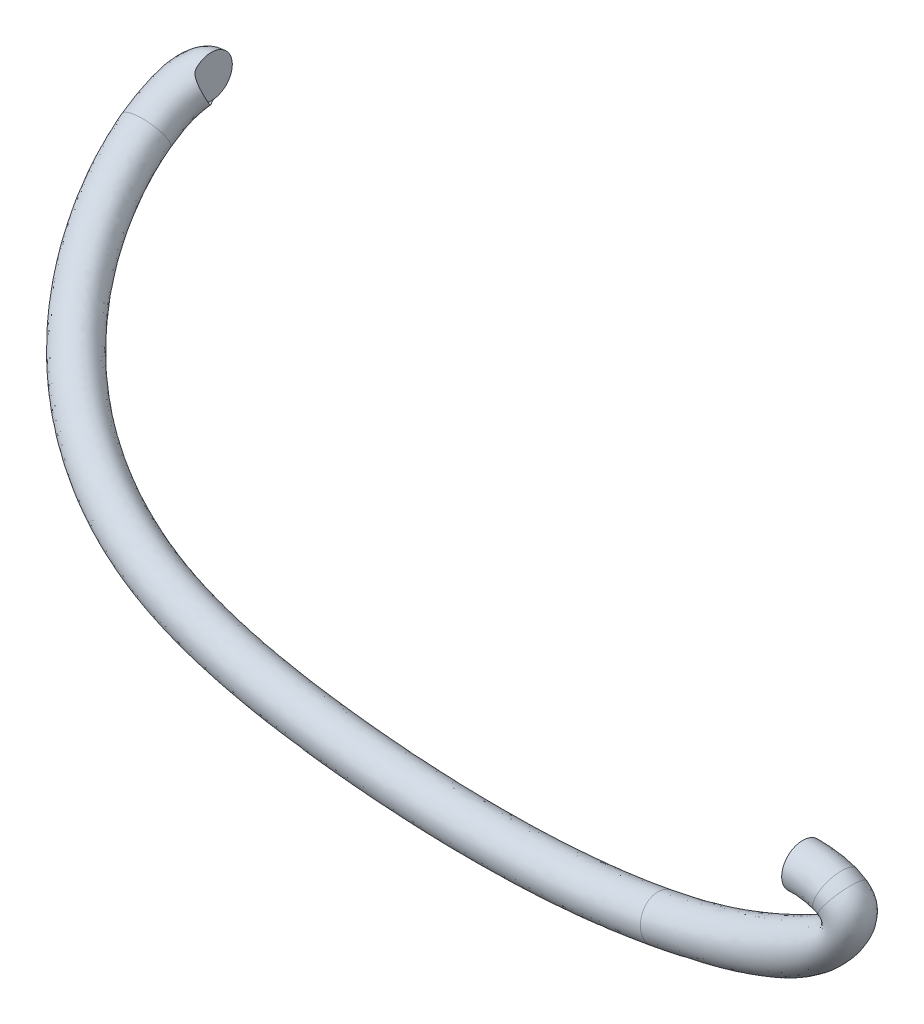
ISO-10303-21;
HEADER;
FILE_DESCRIPTION(('STEP AP214'),'2;1');
FILE_NAME('part.step','',(''),(''),'','','');
FILE_SCHEMA(('AUTOMOTIVE_DESIGN { 1 0 10303 214 1 1 1 1 }'));
ENDSEC;
DATA;
#1=APPLICATION_CONTEXT('core data for automotive mechanical design processes');
#2=APPLICATION_PROTOCOL_DEFINITION('international standard','automotive_design',2000,#1);
#3=PRODUCT_CONTEXT('',#1,'mechanical');
#4=PRODUCT('Part','Part','',(#3));
#5=PRODUCT_RELATED_PRODUCT_CATEGORY('part','',(#4));
#6=PRODUCT_DEFINITION_FORMATION('','',#4);
#7=PRODUCT_DEFINITION_CONTEXT('part definition',#1,'design');
#8=PRODUCT_DEFINITION('design','',#6,#7);
#9=PRODUCT_DEFINITION_SHAPE('','',#8);
#10=(LENGTH_UNIT() NAMED_UNIT(*) SI_UNIT(.MILLI.,.METRE.));
#11=(NAMED_UNIT(*) PLANE_ANGLE_UNIT() SI_UNIT($,.RADIAN.));
#12=(NAMED_UNIT(*) SI_UNIT($,.STERADIAN.) SOLID_ANGLE_UNIT());
#13=UNCERTAINTY_MEASURE_WITH_UNIT(LENGTH_MEASURE(1.E-05),#10,'distance_accuracy_value','');
#14=(GEOMETRIC_REPRESENTATION_CONTEXT(3) GLOBAL_UNCERTAINTY_ASSIGNED_CONTEXT((#13)) GLOBAL_UNIT_ASSIGNED_CONTEXT((#10,
#11,#12)) REPRESENTATION_CONTEXT('',''));
#15=CARTESIAN_POINT('',(0.,0.,0.));
#16=DIRECTION('',(0.,0.,1.));
#17=DIRECTION('',(1.,0.,0.));
#18=AXIS2_PLACEMENT_3D('',#15,#16,#17);
#19=CARTESIAN_POINT('',(271.467470703832,62.9021160797935,181.52291610421));
#20=DIRECTION('',(1.,0.,0.));
#21=DIRECTION('',(0.,0.,-1.));
#22=AXIS2_PLACEMENT_3D('',#19,#20,#21);
#23=PLANE('',#22);
#24=CARTESIAN_POINT('',(271.467470703832,62.9021160797935,181.52291610421));
#25=DIRECTION('',(1.,0.,0.));
#26=DIRECTION('',(0.,0.,-1.));
#27=AXIS2_PLACEMENT_3D('',#24,#25,#26);
#28=CIRCLE('',#27,8.00000000000001);
#29=CARTESIAN_POINT('',(271.467470703832,62.9021160797935,173.52291610421));
#30=VERTEX_POINT('',#29);
#31=EDGE_CURVE('E38',#30,#30,#28,.T.);
#32=ORIENTED_EDGE('',*,*,#31,.F.);
#33=EDGE_LOOP('',(#32));
#34=FACE_BOUND('',#33,.T.);
#35=ADVANCED_FACE('F35',(#34),#23,.F.);
#36=CARTESIAN_POINT('',(-65.7016419080952,98.6716742459517,69.8195888462359));
#37=DIRECTION('',(1.,1.38037576269946E-12,-1.07162146066599E-13));
#38=DIRECTION('',(1.27158228966191E-12,-0.885032139258221,0.465529926513864));
#39=AXIS2_PLACEMENT_3D('',#36,#37,#38);
#40=PLANE('',#39);
#41=CARTESIAN_POINT('',(-65.7016419080952,98.6716742459517,69.8195888462359));
#42=DIRECTION('',(-1.,-1.37902013196725E-12,1.05987701605733E-13));
#43=DIRECTION('',(1.26981758441503E-12,-0.885032139258227,0.465529926513867));
#44=AXIS2_PLACEMENT_3D('',#41,#42,#43);
#45=CIRCLE('',#44,7.99999999999996);
#46=CARTESIAN_POINT('',(-65.701641908085,91.5914171318859,73.5438282583468));
#47=VERTEX_POINT('',#46);
#48=EDGE_CURVE('E44',#47,#47,#45,.T.);
#49=ORIENTED_EDGE('',*,*,#48,.F.);
#50=EDGE_LOOP('',(#49));
#51=FACE_BOUND('',#50,.T.);
#52=ADVANCED_FACE('F258',(#51),#40,.T.);
#53=CARTESIAN_POINT('',(271.467470703832,62.9021160797935,173.52291610421));
#54=CARTESIAN_POINT('',(274.677446249311,62.9052396736422,173.522916104121));
#55=CARTESIAN_POINT('',(277.473503314875,62.6825918502121,173.53570040913));
#56=CARTESIAN_POINT('',(281.460180135996,61.9790707380052,173.575370648221));
#57=CARTESIAN_POINT('',(282.876155099257,61.6083107984834,173.596175101743));
#58=CARTESIAN_POINT('',(284.111598290549,61.1540883737996,173.621492785296));
#59=CARTESIAN_POINT('',(271.467470703832,78.9021160797935,173.52291610421));
#60=CARTESIAN_POINT('',(275.428867519354,78.9052396740792,173.529163292394));
#61=CARTESIAN_POINT('',(279.115790153637,78.6414527736942,173.550584008224));
#62=CARTESIAN_POINT('',(285.034623800124,77.5944642644376,173.619567355465));
#63=CARTESIAN_POINT('',(287.353420199476,77.0236434522984,173.655508590819));
#64=CARTESIAN_POINT('',(289.654417462155,76.1710320667003,173.706674334146));
#65=CARTESIAN_POINT('',(271.467470703832,78.9021160797935,189.52291610421));
#66=CARTESIAN_POINT('',(275.386330294475,78.8989924857788,189.529163292527));
#67=CARTESIAN_POINT('',(279.022378786546,78.6312395671412,189.550447662841));
#68=CARTESIAN_POINT('',(284.830064090743,77.5937629216673,189.618322155168));
#69=CARTESIAN_POINT('',(287.096763138848,77.0304434161902,189.653616873337));
#70=CARTESIAN_POINT('',(289.336141169666,76.1968734080824,189.703511221864));
#71=CARTESIAN_POINT('',(271.467470703832,62.9021160797935,189.52291610421));
#72=CARTESIAN_POINT('',(274.634909024432,62.8989924853253,189.522916104254));
#73=CARTESIAN_POINT('',(277.380091947784,62.6723786436508,189.535564063747));
#74=CARTESIAN_POINT('',(281.255620426614,61.9783693952406,189.574125447924));
#75=CARTESIAN_POINT('',(282.619498038629,61.6151107623789,189.594283384261));
#76=CARTESIAN_POINT('',(283.793321998059,61.1799297151835,189.618329673014));
#77=CARTESIAN_POINT('',(271.467470703832,46.9021160797935,189.52291610421));
#78=CARTESIAN_POINT('',(273.883487754388,46.8989924848717,189.516668915981));
#79=CARTESIAN_POINT('',(275.737805109022,46.7135177201605,189.520680464653));
#80=CARTESIAN_POINT('',(277.681176762486,46.3629758688138,189.52992874068));
#81=CARTESIAN_POINT('',(278.14223293841,46.1997781085676,189.534949895186));
#82=CARTESIAN_POINT('',(278.250502826453,46.1629860222847,189.533148124163));
#83=CARTESIAN_POINT('',(271.467470703832,46.9021160797935,173.52291610421));
#84=CARTESIAN_POINT('',(273.926024979267,46.9052396732052,173.516668915849));
#85=CARTESIAN_POINT('',(275.831216476113,46.7237309267301,173.520816810036));
#86=CARTESIAN_POINT('',(277.885736471867,46.3636772115729,173.531173940976));
#87=CARTESIAN_POINT('',(278.398889999038,46.1929781446684,173.536841612667));
#88=CARTESIAN_POINT('',(278.568779118942,46.1371446808989,173.536311236445));
#89=CARTESIAN_POINT('',(271.467470703832,62.9021160797935,173.52291610421));
#90=CARTESIAN_POINT('',(274.677446249311,62.9052396736422,173.522916104121));
#91=CARTESIAN_POINT('',(277.473503314875,62.6825918502121,173.53570040913));
#92=CARTESIAN_POINT('',(281.460180135996,61.9790707380052,173.575370648221));
#93=CARTESIAN_POINT('',(282.876155099257,61.6083107984834,173.596175101743));
#94=CARTESIAN_POINT('',(284.111598290549,61.1540883737996,173.621492785296));
#95=(BOUNDED_SURFACE() B_SPLINE_SURFACE(3,3,((#53,#54,#55,#56,#57,#58),(#59,#60,#61,#62,#63,
#64),(#65,#66,#67,#68,#69,#70),(#71,#72,#73,#74,#75,#76),(#77,#78,#79,#80,#81,#82),(#83,#84,#85,
#86,#87,#88),(#89,#90,#91,#92,#93,#94)),.UNSPECIFIED.,.T.,.F.,
.F.) B_SPLINE_SURFACE_WITH_KNOTS((4,3,4),(4,2,4),(0.,0.5,1.),(0.,0.0323005337941138,
0.0539153814628909),
.UNSPECIFIED.) GEOMETRIC_REPRESENTATION_ITEM() RATIONAL_B_SPLINE_SURFACE(((1.,1.,1.,1.,1.,1.),
(0.333333333333333,0.333333333333333,0.333333333333333,0.333333333333333,0.333333333333333,
0.333333333333333),(0.333333333333333,0.333333333333333,0.333333333333333,0.333333333333333,
0.333333333333333,0.333333333333333),(1.,1.,1.,1.,1.,1.),(0.333333333333333,0.333333333333333,
0.333333333333333,0.333333333333333,0.333333333333333,0.333333333333333),(0.333333333333333,
0.333333333333333,0.333333333333333,0.333333333333333,0.333333333333333,0.333333333333333),(1.,
1.,1.,1.,1.,1.))) REPRESENTATION_ITEM('') SURFACE());
#96=CARTESIAN_POINT('',(282.078727264844,55.7806513729378,176.007103294689));
#97=CARTESIAN_POINT('',(282.689599319364,57.3408124351189,174.307543443574));
#98=CARTESIAN_POINT('',(283.428356558063,59.303008209044,173.610992787513));
#99=CARTESIAN_POINT('',(284.111598290549,61.1540883737996,173.621492785296));
#100=(BOUNDED_CURVE() B_SPLINE_CURVE(3,(#96,#97,#98,#99),.UNSPECIFIED.,.F.,
.F.) B_SPLINE_CURVE_WITH_KNOTS((4,4),(0.851669169431987,1.),
.UNSPECIFIED.) CURVE() GEOMETRIC_REPRESENTATION_ITEM() RATIONAL_B_SPLINE_CURVE((0.58269296010392,
0.663123212610623,0.802225559242649,1.)) REPRESENTATION_ITEM(''));
#101=CARTESIAN_POINT('',(282.078727264844,55.7806513729377,176.007103294688));
#102=VERTEX_POINT('',#101);
#103=CARTESIAN_POINT('',(284.111598290549,61.1540883737996,173.621492785296));
#104=VERTEX_POINT('',#103);
#105=EDGE_CURVE('E65',#102,#104,#100,.T.);
#106=CARTESIAN_POINT('',(282.075598232249,56.4259635095282,187.786529357995));
#107=CARTESIAN_POINT('',(280.806349768581,52.8128698214774,184.625389384865));
#108=CARTESIAN_POINT('',(280.780476700636,52.4649325341985,179.619078207091));
#109=CARTESIAN_POINT('',(282.078727264844,55.7806513729377,176.007103294688));
#110=(BOUNDED_CURVE() B_SPLINE_CURVE(3,(#106,#107,#108,#109),.UNSPECIFIED.,.F.,
.F.) B_SPLINE_CURVE_WITH_KNOTS((4,4),(0.631435469297599,0.851669169431987),
.UNSPECIFIED.) CURVE() GEOMETRIC_REPRESENTATION_ITEM() RATIONAL_B_SPLINE_CURVE((0.612460383525445,
0.473196888585247,0.463274414111406,0.582692960103921)) REPRESENTATION_ITEM(''));
#111=CARTESIAN_POINT('',(282.075598232248,56.4259635095268,187.786529357993));
#112=VERTEX_POINT('',#111);
#113=EDGE_CURVE('E73',#112,#102,#110,.T.);
#114=CARTESIAN_POINT('',(284.111598290549,61.1540883737996,173.621492785296));
#115=CARTESIAN_POINT('',(289.654417462155,76.1710320667003,173.706674334146));
#116=CARTESIAN_POINT('',(289.336141169666,76.1968734080824,189.703511221864));
#117=CARTESIAN_POINT('',(283.793321998059,61.1799297151835,189.618329673014));
#118=CARTESIAN_POINT('',(283.204439995542,59.584494684783,189.609279787114));
#119=CARTESIAN_POINT('',(282.59091552738,57.8928864325641,189.069958211457));
#120=CARTESIAN_POINT('',(282.075598232249,56.4259635095282,187.786529357995));
#121=(BOUNDED_CURVE() B_SPLINE_CURVE(3,(#114,#115,#116,#117,#118,#119,#120),.UNSPECIFIED.,.F.,
.F.) B_SPLINE_CURVE_WITH_KNOTS((4,3,4),(0.,0.5,0.631435469297599),
.UNSPECIFIED.) CURVE() GEOMETRIC_REPRESENTATION_ITEM() RATIONAL_B_SPLINE_CURVE((1.,
0.333333333333333,0.333333333333333,1.,0.824752707603202,0.695572835445017,0.612460383525445)) REPRESENTATION_ITEM(''));
#122=EDGE_CURVE('E77',#104,#112,#121,.T.);
#123=ORIENTED_EDGE('',*,*,#31,.T.);
#124=EDGE_LOOP('',(#123));
#125=FACE_BOUND('',#124,.T.);
#126=ORIENTED_EDGE('',*,*,#105,.F.);
#127=ORIENTED_EDGE('',*,*,#113,.F.);
#128=ORIENTED_EDGE('',*,*,#122,.F.);
#129=EDGE_LOOP('',(#126,#127,#128));
#130=FACE_BOUND('',#129,.T.);
#131=ADVANCED_FACE('F71',(#125,#130),#95,.T.);
#132=CARTESIAN_POINT('',(282.078727264844,55.7806513729378,176.007103294689));
#133=CARTESIAN_POINT('',(282.496259313601,55.6280452412415,176.014948842265));
#134=CARTESIAN_POINT('',(282.85507631222,55.4728237345064,176.022936949126));
#135=CARTESIAN_POINT('',(283.399679860729,55.1972709656049,176.037079804352));
#136=CARTESIAN_POINT('',(283.604778804446,55.0767611857829,176.043247061547));
#137=CARTESIAN_POINT('',(283.772684239871,54.9661613270195,176.048868356546));
#138=CARTESIAN_POINT('',(282.689599319364,57.3408124351189,174.307543443574));
#139=CARTESIAN_POINT('',(283.165210018478,57.1667028995138,174.316786062232));
#140=CARTESIAN_POINT('',(283.58649353589,56.9846320223015,174.326460006813));
#141=CARTESIAN_POINT('',(284.253792064225,56.6470949589537,174.344379889541));
#142=CARTESIAN_POINT('',(284.517580743987,56.4933954400473,174.352533505776));
#143=CARTESIAN_POINT('',(284.746354026793,56.3426257548287,174.360516948192));
#144=CARTESIAN_POINT('',(283.428356558063,59.303008209044,173.610992787513));
#145=CARTESIAN_POINT('',(283.974186384542,59.1027325838966,173.621933886928));
#146=CARTESIAN_POINT('',(284.470991806919,58.8880336305549,173.633655327957));
#147=CARTESIAN_POINT('',(285.286624677687,58.475254852761,173.656158454628));
#148=CARTESIAN_POINT('',(285.621366201044,58.2812927399576,173.666721125812));
#149=CARTESIAN_POINT('',(285.923723300902,58.0818211143121,173.677567954064));
#150=CARTESIAN_POINT('',(284.111598290549,61.1540883737996,173.621492785296));
#151=CARTESIAN_POINT('',(284.72236170513,60.9295354028216,173.634009034496));
#152=CARTESIAN_POINT('',(285.289003229135,60.6845842349098,173.647628315254));
#153=CARTESIAN_POINT('',(286.241801058927,60.2020825042233,173.674377736952));
#154=CARTESIAN_POINT('',(286.642152196562,59.9708233669124,173.687171732118));
#155=CARTESIAN_POINT('',(287.01255066956,59.7262505325922,173.700670011776));
#156=(BOUNDED_SURFACE() B_SPLINE_SURFACE(3,3,((#132,#133,#134,#135,#136,#137),(#138,#139,#140,
#141,#142,#143),(#144,#145,#146,#147,#148,#149),(#150,#151,#152,#153,#154,#155)),.UNSPECIFIED.,
.F.,.F.,.F.) B_SPLINE_SURFACE_WITH_KNOTS((4,4),(4,2,4),(0.851669169431987,1.),
(0.0539153814628909,0.0646010675882275,0.0733924405911268),
.UNSPECIFIED.) GEOMETRIC_REPRESENTATION_ITEM() RATIONAL_B_SPLINE_SURFACE(((0.58269296010392,
0.58269296010392,0.58269296010392,0.58269296010392,0.58269296010392,0.58269296010392),
(0.663123212610623,0.663123212610623,0.663123212610623,0.663123212610623,0.663123212610623,
0.663123212610623),(0.802225559242649,0.802225559242649,0.802225559242649,0.802225559242649,
0.802225559242649,0.802225559242649),(1.,1.,1.,1.,1.,1.))) REPRESENTATION_ITEM('') SURFACE());
#157=CARTESIAN_POINT('',(284.111598290549,61.1540883737996,173.621492785296));
#158=CARTESIAN_POINT('',(284.72236170513,60.9295354028216,173.634009034496));
#159=CARTESIAN_POINT('',(285.289003229135,60.6845842349098,173.647628315254));
#160=CARTESIAN_POINT('',(286.241801058927,60.2020825042233,173.674377736952));
#161=CARTESIAN_POINT('',(286.642152196562,59.9708233669124,173.687171732118));
#162=CARTESIAN_POINT('',(287.01255066956,59.7262505325922,173.700670011776));
#163=(BOUNDED_CURVE() B_SPLINE_CURVE(3,(#157,#158,#159,#160,#161,#162),.UNSPECIFIED.,.F.,
.F.) B_SPLINE_CURVE_WITH_KNOTS((4,2,4),(0.0539153814628909,0.0646010675882275,
0.0733924405911268),
.UNSPECIFIED.) CURVE() GEOMETRIC_REPRESENTATION_ITEM() RATIONAL_B_SPLINE_CURVE((1.,1.,1.,1.,1.,1.)) REPRESENTATION_ITEM(''));
#164=CARTESIAN_POINT('',(287.01255066956,59.7262505325922,173.700670011776));
#165=VERTEX_POINT('',#164);
#166=EDGE_CURVE('E91',#165,#104,#163,.F.);
#167=CARTESIAN_POINT('',(287.01255066956,59.7262505325922,173.700670011776));
#168=CARTESIAN_POINT('',(295.845695553149,73.066733809027,173.888086152071));
#169=CARTESIAN_POINT('',(295.336872307015,73.178863479634,189.879603104873));
#170=CARTESIAN_POINT('',(286.50372742343,59.8383802031993,189.692186964578));
#171=CARTESIAN_POINT('',(277.670582539846,46.4978969267645,189.504770824284));
#172=CARTESIAN_POINT('',(278.179405785971,46.3857672561575,173.513253871482));
#173=CARTESIAN_POINT('',(287.01255066956,59.7262505325922,173.700670011776));
#174=(BOUNDED_CURVE() B_SPLINE_CURVE(3,(#167,#168,#169,#170,#171,#172,#173),.UNSPECIFIED.,.T.,
.F.) B_SPLINE_CURVE_WITH_KNOTS((4,3,4),(0.,0.5,1.),
.UNSPECIFIED.) CURVE() GEOMETRIC_REPRESENTATION_ITEM() RATIONAL_B_SPLINE_CURVE((1.,
0.333333333333333,0.333333333333333,1.,0.333333333333333,0.333333333333333,1.)) REPRESENTATION_ITEM(''));
#175=CARTESIAN_POINT('',(283.772684239871,54.9661613270194,176.048868356546));
#176=VERTEX_POINT('',#175);
#177=EDGE_CURVE('E53',#176,#165,#174,.T.);
#178=CARTESIAN_POINT('',(282.078727264844,55.7806513729377,176.007103294688));
#179=CARTESIAN_POINT('',(282.496259313601,55.6280452412415,176.014948842264));
#180=CARTESIAN_POINT('',(282.85507631222,55.4728237345064,176.022936949126));
#181=CARTESIAN_POINT('',(283.399679860729,55.1972709656049,176.037079804352));
#182=CARTESIAN_POINT('',(283.604778804446,55.0767611857829,176.043247061547));
#183=CARTESIAN_POINT('',(283.772684239871,54.9661613270194,176.048868356546));
#184=(BOUNDED_CURVE() B_SPLINE_CURVE(3,(#178,#179,#180,#181,#182,#183),.UNSPECIFIED.,.F.,
.F.) B_SPLINE_CURVE_WITH_KNOTS((4,2,4),(0.0539153814628909,0.0646010675882275,
0.0733924405911268),
.UNSPECIFIED.) CURVE() GEOMETRIC_REPRESENTATION_ITEM() RATIONAL_B_SPLINE_CURVE((0.582692960103921,
0.582692960103921,0.582692960103921,0.582692960103921,0.582692960103921,0.582692960103921)) REPRESENTATION_ITEM(''));
#185=EDGE_CURVE('E80',#102,#176,#184,.T.);
#186=ORIENTED_EDGE('',*,*,#105,.T.);
#187=ORIENTED_EDGE('',*,*,#166,.F.);
#188=ORIENTED_EDGE('',*,*,#177,.F.);
#189=ORIENTED_EDGE('',*,*,#185,.F.);
#190=EDGE_LOOP('',(#186,#187,#188,#189));
#191=FACE_BOUND('',#190,.T.);
#192=ADVANCED_FACE('F83',(#191),#156,.T.);
#193=CARTESIAN_POINT('',(282.075598232249,56.4259635095282,187.786529357995));
#194=CARTESIAN_POINT('',(282.492675089337,56.2720730388335,187.794445147861));
#195=CARTESIAN_POINT('',(282.850982501147,56.1156218666339,187.802500252224));
#196=CARTESIAN_POINT('',(283.394553430249,55.8379515840959,187.816758039927));
#197=CARTESIAN_POINT('',(283.599148146244,55.7165321930273,187.822974499835));
#198=CARTESIAN_POINT('',(283.766511149759,55.6050759063096,187.828641961762));
#199=CARTESIAN_POINT('',(280.806349768581,52.8128698214774,184.625389384865));
#200=CARTESIAN_POINT('',(281.102842511417,52.7044512227314,184.630358383515));
#201=CARTESIAN_POINT('',(281.331466998592,52.6045640674628,184.634867711393));
#202=CARTESIAN_POINT('',(281.620336398879,52.4570670350683,184.641201377647));
#203=CARTESIAN_POINT('',(281.7031034088,52.4052219492089,184.643256890728));
#204=CARTESIAN_POINT('',(281.744128481348,52.3778330377919,184.643983237584));
#205=CARTESIAN_POINT('',(280.780476700636,52.4649325341985,179.619078207091));
#206=CARTESIAN_POINT('',(281.074577598737,52.3580263261616,179.623954641402));
#207=CARTESIAN_POINT('',(281.300638167154,52.259866212418,179.628359936193));
#208=CARTESIAN_POINT('',(281.584485268213,52.1160450305838,179.634475696303));
#209=CARTESIAN_POINT('',(281.664854356681,52.0660714574413,179.636421461082));
#210=CARTESIAN_POINT('',(281.703400924536,52.0408421758282,179.63702262266));
#211=CARTESIAN_POINT('',(282.078727264844,55.7806513729377,176.007103294688));
#212=CARTESIAN_POINT('',(282.496259313601,55.6280452412415,176.014948842264));
#213=CARTESIAN_POINT('',(282.85507631222,55.4728237345064,176.022936949126));
#214=CARTESIAN_POINT('',(283.399679860729,55.1972709656049,176.037079804352));
#215=CARTESIAN_POINT('',(283.604778804446,55.0767611857829,176.043247061547));
#216=CARTESIAN_POINT('',(283.772684239871,54.9661613270194,176.048868356546));
#217=(BOUNDED_SURFACE() B_SPLINE_SURFACE(3,3,((#193,#194,#195,#196,#197,#198),(#199,#200,#201,
#202,#203,#204),(#205,#206,#207,#208,#209,#210),(#211,#212,#213,#214,#215,#216)),.UNSPECIFIED.,
.F.,.F.,.F.) B_SPLINE_SURFACE_WITH_KNOTS((4,4),(4,2,4),(0.631435469297599,0.851669169431987),
(0.0539153814628909,0.0646010675882275,0.0733924405911268),
.UNSPECIFIED.) GEOMETRIC_REPRESENTATION_ITEM() RATIONAL_B_SPLINE_SURFACE(((0.612460383525445,
0.612460383525445,0.612460383525445,0.612460383525445,0.612460383525445,0.612460383525445),
(0.473196888585247,0.473196888585247,0.473196888585247,0.473196888585247,0.473196888585247,
0.473196888585247),(0.463274414111406,0.463274414111406,0.463274414111406,0.463274414111406,
0.463274414111406,0.463274414111406),(0.582692960103921,0.582692960103921,0.582692960103921,
0.582692960103921,0.582692960103921,0.582692960103921))) REPRESENTATION_ITEM('') SURFACE());
#218=CARTESIAN_POINT('',(287.01255066956,59.7262505325922,173.700670011776));
#219=CARTESIAN_POINT('',(295.845695553149,73.066733809027,173.888086152071));
#220=CARTESIAN_POINT('',(295.336872307015,73.178863479634,189.879603104873));
#221=CARTESIAN_POINT('',(286.50372742343,59.8383802031993,189.692186964578));
#222=CARTESIAN_POINT('',(277.670582539846,46.4978969267645,189.504770824284));
#223=CARTESIAN_POINT('',(278.179405785971,46.3857672561575,173.513253871482));
#224=CARTESIAN_POINT('',(287.01255066956,59.7262505325922,173.700670011776));
#225=(BOUNDED_CURVE() B_SPLINE_CURVE(3,(#218,#219,#220,#221,#222,#223,#224),.UNSPECIFIED.,.T.,
.F.) B_SPLINE_CURVE_WITH_KNOTS((4,3,4),(0.,0.5,1.),
.UNSPECIFIED.) CURVE() GEOMETRIC_REPRESENTATION_ITEM() RATIONAL_B_SPLINE_CURVE((1.,
0.333333333333333,0.333333333333333,1.,0.333333333333333,0.333333333333333,1.)) REPRESENTATION_ITEM(''));
#226=CARTESIAN_POINT('',(283.766511149759,55.6050759063086,187.828641961761));
#227=VERTEX_POINT('',#226);
#228=EDGE_CURVE('E186',#227,#176,#225,.T.);
#229=CARTESIAN_POINT('',(282.075598232249,56.4259635095282,187.786529357995));
#230=CARTESIAN_POINT('',(282.492675089337,56.2720730388335,187.794445147861));
#231=CARTESIAN_POINT('',(282.850982501147,56.1156218666339,187.802500252224));
#232=CARTESIAN_POINT('',(283.394553430249,55.8379515840959,187.816758039927));
#233=CARTESIAN_POINT('',(283.599148146244,55.7165321930273,187.822974499835));
#234=CARTESIAN_POINT('',(283.766511149759,55.6050759063096,187.828641961762));
#235=(BOUNDED_CURVE() B_SPLINE_CURVE(3,(#229,#230,#231,#232,#233,#234),.UNSPECIFIED.,.F.,
.F.) B_SPLINE_CURVE_WITH_KNOTS((4,2,4),(0.0539153814628909,0.0646010675882275,
0.0733924405911268),
.UNSPECIFIED.) CURVE() GEOMETRIC_REPRESENTATION_ITEM() RATIONAL_B_SPLINE_CURVE((0.612460383525445,
0.612460383525445,0.612460383525445,0.612460383525445,0.612460383525445,0.612460383525445)) REPRESENTATION_ITEM(''));
#236=EDGE_CURVE('E90',#112,#227,#235,.T.);
#237=ORIENTED_EDGE('',*,*,#113,.T.);
#238=ORIENTED_EDGE('',*,*,#185,.T.);
#239=ORIENTED_EDGE('',*,*,#228,.F.);
#240=ORIENTED_EDGE('',*,*,#236,.F.);
#241=EDGE_LOOP('',(#237,#238,#239,#240));
#242=FACE_BOUND('',#241,.T.);
#243=ADVANCED_FACE('F88',(#242),#217,.T.);
#244=CARTESIAN_POINT('',(284.111598290549,61.1540883737996,173.621492785296));
#245=CARTESIAN_POINT('',(284.72236170513,60.9295354028216,173.634009034496));
#246=CARTESIAN_POINT('',(285.289003229135,60.6845842349098,173.647628315254));
#247=CARTESIAN_POINT('',(286.241801058927,60.2020825042233,173.674377736952));
#248=CARTESIAN_POINT('',(286.642152196562,59.9708233669124,173.687171732118));
#249=CARTESIAN_POINT('',(287.01255066956,59.7262505325922,173.700670011776));
#250=CARTESIAN_POINT('',(289.654417462155,76.1710320667003,173.706674334146));
#251=CARTESIAN_POINT('',(290.79195656958,75.7495283951038,173.73196903351));
#252=CARTESIAN_POINT('',(291.925145575346,75.2591552236309,173.760984596339));
#253=CARTESIAN_POINT('',(293.990698274168,74.2110239337139,173.822182214575));
#254=CARTESIAN_POINT('',(294.923309387402,73.6771915596486,173.853077892877));
#255=CARTESIAN_POINT('',(295.845695553149,73.066733809027,173.888086152071));
#256=CARTESIAN_POINT('',(289.336141169666,76.1968734080824,189.703511221864));
#257=CARTESIAN_POINT('',(290.443217708903,75.7847831816498,189.728177384493));
#258=CARTESIAN_POINT('',(291.54361700279,75.3066438438893,189.756411690757));
#259=CARTESIAN_POINT('',(293.544724370546,74.2876814987786,189.815813792482));
#260=CARTESIAN_POINT('',(294.446495593643,73.7697556083074,189.845750767875));
#261=CARTESIAN_POINT('',(295.336872307015,73.178863479634,189.879603104873));
#262=CARTESIAN_POINT('',(283.793321998059,61.1799297151835,189.618329673014));
#263=CARTESIAN_POINT('',(284.373622844453,60.9647901893685,189.63021738548));
#264=CARTESIAN_POINT('',(284.907474656579,60.7320728551681,189.643055409672));
#265=CARTESIAN_POINT('',(285.795827155304,60.278740069288,189.668009314859));
#266=CARTESIAN_POINT('',(286.165338402805,60.0633874155712,189.679844607116));
#267=CARTESIAN_POINT('',(286.50372742343,59.8383802031993,189.692186964578));
#268=CARTESIAN_POINT('',(283.204439995542,59.584494684783,189.609279787114));
#269=CARTESIAN_POINT('',(283.728774966941,59.390279659549,189.61980988731));
#270=CARTESIAN_POINT('',(284.2024354567,59.1836365299084,189.63101217468));
#271=CARTESIAN_POINT('',(284.972566289645,58.7903975441703,189.652306223333));
#272=CARTESIAN_POINT('',(285.285528999194,58.6071909749733,189.662218350665));
#273=CARTESIAN_POINT('',(285.565273563306,58.4210562272319,189.672275437865));
#274=CARTESIAN_POINT('',(282.59091552738,57.8928864325641,189.069958211457));
#275=CARTESIAN_POINT('',(283.056949764659,57.7205342951998,189.079070404174));
#276=CARTESIAN_POINT('',(283.467908691015,57.5411180243289,189.088565100547));
#277=CARTESIAN_POINT('',(284.114888926216,57.2105971541537,189.106040096659));
#278=CARTESIAN_POINT('',(284.368945923052,57.0609304625783,189.113945908909));
#279=CARTESIAN_POINT('',(284.587602367309,56.9153426612762,189.121619472972));
#280=CARTESIAN_POINT('',(282.075598232249,56.4259635095282,187.786529357995));
#281=CARTESIAN_POINT('',(282.492675089337,56.2720730388335,187.794445147861));
#282=CARTESIAN_POINT('',(282.850982501147,56.1156218666339,187.802500252224));
#283=CARTESIAN_POINT('',(283.394553430249,55.8379515840959,187.816758039927));
#284=CARTESIAN_POINT('',(283.599148146244,55.7165321930273,187.822974499835));
#285=CARTESIAN_POINT('',(283.766511149759,55.6050759063096,187.828641961762));
#286=(BOUNDED_SURFACE() B_SPLINE_SURFACE(3,3,((#244,#245,#246,#247,#248,#249),(#250,#251,#252,
#253,#254,#255),(#256,#257,#258,#259,#260,#261),(#262,#263,#264,#265,#266,#267),(#268,#269,#270,
#271,#272,#273),(#274,#275,#276,#277,#278,#279),(#280,#281,#282,#283,#284,#285)),.UNSPECIFIED.,
.F.,.F.,.F.) B_SPLINE_SURFACE_WITH_KNOTS((4,3,4),(4,2,4),(0.,0.5,0.631435469297599),
(0.0539153814628909,0.0646010675882275,0.0733924405911268),
.UNSPECIFIED.) GEOMETRIC_REPRESENTATION_ITEM() RATIONAL_B_SPLINE_SURFACE(((1.,1.,1.,1.,1.,1.),
(0.333333333333333,0.333333333333333,0.333333333333333,0.333333333333333,0.333333333333333,
0.333333333333333),(0.333333333333333,0.333333333333333,0.333333333333333,0.333333333333333,
0.333333333333333,0.333333333333333),(1.,1.,1.,1.,1.,1.),(0.824752707603202,0.824752707603202,
0.824752707603202,0.824752707603202,0.824752707603202,0.824752707603202),(0.695572835445017,
0.695572835445017,0.695572835445017,0.695572835445017,0.695572835445017,0.695572835445017),
(0.612460383525445,0.612460383525445,0.612460383525445,0.612460383525445,0.612460383525445,0.612460383525445))) REPRESENTATION_ITEM('') SURFACE());
#287=CARTESIAN_POINT('',(287.01255066956,59.7262505325922,173.700670011776));
#288=CARTESIAN_POINT('',(295.845695553149,73.066733809027,173.888086152071));
#289=CARTESIAN_POINT('',(295.336872307015,73.178863479634,189.879603104873));
#290=CARTESIAN_POINT('',(286.50372742343,59.8383802031993,189.692186964578));
#291=CARTESIAN_POINT('',(277.670582539846,46.4978969267645,189.504770824284));
#292=CARTESIAN_POINT('',(278.179405785971,46.3857672561575,173.513253871482));
#293=CARTESIAN_POINT('',(287.01255066956,59.7262505325922,173.700670011776));
#294=(BOUNDED_CURVE() B_SPLINE_CURVE(3,(#287,#288,#289,#290,#291,#292,#293),.UNSPECIFIED.,.T.,
.F.) B_SPLINE_CURVE_WITH_KNOTS((4,3,4),(0.,0.5,1.),
.UNSPECIFIED.) CURVE() GEOMETRIC_REPRESENTATION_ITEM() RATIONAL_B_SPLINE_CURVE((1.,
0.333333333333333,0.333333333333333,1.,0.333333333333333,0.333333333333333,1.)) REPRESENTATION_ITEM(''));
#295=EDGE_CURVE('E212',#165,#227,#294,.T.);
#296=ORIENTED_EDGE('',*,*,#122,.T.);
#297=ORIENTED_EDGE('',*,*,#236,.T.);
#298=ORIENTED_EDGE('',*,*,#295,.F.);
#299=ORIENTED_EDGE('',*,*,#166,.T.);
#300=EDGE_LOOP('',(#296,#297,#298,#299));
#301=FACE_BOUND('',#300,.T.);
#302=ADVANCED_FACE('F112',(#301),#286,.T.);
#303=CARTESIAN_POINT('',(287.01255066956,59.7262505325922,173.700670011776));
#304=CARTESIAN_POINT('',(293.285565294338,55.5842006097221,173.929274911303));
#305=CARTESIAN_POINT('',(287.472587837258,40.1936666938714,174.760911118051));
#306=CARTESIAN_POINT('',(247.882013090926,24.6402642432276,175.451220485516));
#307=CARTESIAN_POINT('',(219.817066004035,19.4718454052599,175.583489614259));
#308=CARTESIAN_POINT('',(295.845695553149,73.066733809027,173.888086152071));
#309=CARTESIAN_POINT('',(311.467093396895,62.7281102006173,174.480980934096));
#310=CARTESIAN_POINT('',(293.994796005317,17.9284049716114,176.922439497126));
#311=CARTESIAN_POINT('',(252.29162953337,9.29079724708336,177.297301899808));
#312=CARTESIAN_POINT('',(222.697793493633,3.84484043421254,177.456123340142));
#313=CARTESIAN_POINT('',(295.336872307015,73.178863479634,189.879603104873));
#314=CARTESIAN_POINT('',(310.416162724533,63.1716003966347,190.452921356843));
#315=CARTESIAN_POINT('',(293.542276425652,20.0718287268779,192.801260360236));
#316=CARTESIAN_POINT('',(251.941909933922,11.1107944525582,193.189865427885));
#317=CARTESIAN_POINT('',(222.431084203696,5.69983882242716,193.345990426503));
#318=CARTESIAN_POINT('',(286.50372742343,59.8383802031993,189.692186964578));
#319=CARTESIAN_POINT('',(292.234634622001,56.0276908057388,189.901215334051));
#320=CARTESIAN_POINT('',(287.020068257583,42.3370904491074,190.639731981129));
#321=CARTESIAN_POINT('',(247.532293491478,26.4602614487643,191.343784013654));
#322=CARTESIAN_POINT('',(219.550356714098,21.3268437934848,191.473356700631));
#323=CARTESIAN_POINT('',(277.670582539846,46.4978969267645,189.504770824284));
#324=CARTESIAN_POINT('',(274.053106519466,48.883781214843,189.349509311258));
#325=CARTESIAN_POINT('',(280.497860089515,64.6023521713367,188.478203602023));
#326=CARTESIAN_POINT('',(243.122677049034,41.8097284449704,189.497702599424));
#327=CARTESIAN_POINT('',(216.669629224499,36.9538487645425,189.600722974758));
#328=CARTESIAN_POINT('',(278.179405785971,46.3857672561575,173.513253871482));
#329=CARTESIAN_POINT('',(275.104037191781,48.4402910188265,173.37756888851));
#330=CARTESIAN_POINT('',(280.950379669199,62.4589284161316,172.599382738975));
#331=CARTESIAN_POINT('',(243.472396648482,39.9897312393719,173.605139071224));
#332=CARTESIAN_POINT('',(216.936338514436,35.0988503763073,173.710855888376));
#333=CARTESIAN_POINT('',(287.01255066956,59.7262505325922,173.700670011776));
#334=CARTESIAN_POINT('',(293.285565294338,55.5842006097221,173.929274911303));
#335=CARTESIAN_POINT('',(287.472587837258,40.1936666938714,174.760911118051));
#336=CARTESIAN_POINT('',(247.882013090926,24.6402642432276,175.451220485516));
#337=CARTESIAN_POINT('',(219.817066004035,19.4718454052599,175.583489614259));
#338=(BOUNDED_SURFACE() B_SPLINE_SURFACE(3,3,((#303,#304,#305,#306,#307),(#308,#309,#310,#311,
#312),(#313,#314,#315,#316,#317),(#318,#319,#320,#321,#322),(#323,#324,#325,#326,#327),(#328,
#329,#330,#331,#332),(#333,#334,#335,#336,#337)),.UNSPECIFIED.,.T.,.F.,
.F.) B_SPLINE_SURFACE_WITH_KNOTS((4,3,4),(4,1,4),(0.,0.5,1.),(0.0733924405911268,
0.222281854126382,0.371171267661636),
.UNSPECIFIED.) GEOMETRIC_REPRESENTATION_ITEM() RATIONAL_B_SPLINE_SURFACE(((1.,1.,1.,1.,1.),
(0.333333333333333,0.333333333333333,0.333333333333333,0.333333333333333,0.333333333333333),
(0.333333333333333,0.333333333333333,0.333333333333333,0.333333333333333,0.333333333333333),(1.,
1.,1.,1.,1.),(0.333333333333333,0.333333333333333,0.333333333333333,0.333333333333333,
0.333333333333333),(0.333333333333333,0.333333333333333,0.333333333333333,0.333333333333333,
0.333333333333333),(1.,1.,1.,1.,1.))) REPRESENTATION_ITEM('') SURFACE());
#339=CARTESIAN_POINT('',(219.817066004035,19.4718454052599,175.583489614259));
#340=CARTESIAN_POINT('',(222.697793493633,3.84484043421254,177.456123340142));
#341=CARTESIAN_POINT('',(222.431084203696,5.69983882242716,193.345990426503));
#342=CARTESIAN_POINT('',(219.550356714098,21.3268437934848,191.473356700631));
#343=CARTESIAN_POINT('',(216.669629224499,36.9538487645425,189.600722974758));
#344=CARTESIAN_POINT('',(216.936338514436,35.0988503763073,173.710855888376));
#345=CARTESIAN_POINT('',(219.817066004035,19.4718454052599,175.583489614259));
#346=(BOUNDED_CURVE() B_SPLINE_CURVE(3,(#339,#340,#341,#342,#343,#344,#345),.UNSPECIFIED.,.T.,
.F.) B_SPLINE_CURVE_WITH_KNOTS((4,3,4),(0.,0.5,1.),
.UNSPECIFIED.) CURVE() GEOMETRIC_REPRESENTATION_ITEM() RATIONAL_B_SPLINE_CURVE((1.,
0.333333333333333,0.333333333333333,1.,0.333333333333333,0.333333333333333,1.)) REPRESENTATION_ITEM(''));
#347=CARTESIAN_POINT('',(219.817066004035,19.4718454052599,175.583489614259));
#348=VERTEX_POINT('',#347);
#349=EDGE_CURVE('E229',#348,#348,#346,.T.);
#350=ORIENTED_EDGE('',*,*,#177,.T.);
#351=ORIENTED_EDGE('',*,*,#295,.T.);
#352=ORIENTED_EDGE('',*,*,#228,.T.);
#353=EDGE_LOOP('',(#350,#351,#352));
#354=FACE_BOUND('',#353,.T.);
#355=ORIENTED_EDGE('',*,*,#349,.F.);
#356=EDGE_LOOP('',(#355));
#357=FACE_BOUND('',#356,.T.);
#358=ADVANCED_FACE('F150',(#354,#357),#338,.T.);
#359=CARTESIAN_POINT('',(219.817066004035,19.4718454052599,175.583489614259));
#360=CARTESIAN_POINT('',(216.719120598303,18.9013301876682,175.598090124228));
#361=CARTESIAN_POINT('',(213.520661254176,18.3639374476685,175.610027402397));
#362=CARTESIAN_POINT('',(184.290254146083,13.9310284228512,175.689885054001));
#363=CARTESIAN_POINT('',(152.166658209351,12.2900931909458,175.580366825399));
#364=CARTESIAN_POINT('',(99.25225399076,15.9215048359749,174.999597329676));
#365=CARTESIAN_POINT('',(83.6815039381305,17.5649106195755,174.790492085072));
#366=CARTESIAN_POINT('',(53.5203277965465,21.8376446278315,173.191100923501));
#367=CARTESIAN_POINT('',(38.9261038326591,24.4668404350026,171.793642918862));
#368=CARTESIAN_POINT('',(14.0485049336085,30.2617030761435,166.952360079835));
#369=CARTESIAN_POINT('',(3.43106710662475,33.4266115533296,163.577217210176));
#370=CARTESIAN_POINT('',(-15.0947173787749,40.1540979210307,155.422887276035));
#371=CARTESIAN_POINT('',(-23.0049514178289,43.7172027080411,150.643092494812));
#372=CARTESIAN_POINT('',(-36.4996043137748,51.0017694365148,140.244183333407));
#373=CARTESIAN_POINT('',(-42.0841209272843,54.7240526839943,134.623420277326));
#374=CARTESIAN_POINT('',(-51.2542114103233,62.0865837178031,123.10064227269));
#375=CARTESIAN_POINT('',(-54.8386313644925,65.7270730340654,117.197787337784));
#376=CARTESIAN_POINT('',(-60.2996260524338,72.6668123803364,105.704583780648));
#377=CARTESIAN_POINT('',(-62.1748586628781,75.9666330484158,100.113465318587));
#378=CARTESIAN_POINT('',(-64.0417341479554,80.7386927586608,91.9479051426667));
#379=CARTESIAN_POINT('',(-64.4858611422575,82.4136354218838,89.0629679538522));
#380=CARTESIAN_POINT('',(-64.7162008618392,83.9383518880712,86.4304522034271));
#381=CARTESIAN_POINT('',(222.697793493633,3.84484043421254,177.456123340142));
#382=CARTESIAN_POINT('',(219.43108188668,3.2436892246268,177.47365482345));
#383=CARTESIAN_POINT('',(216.066838439128,2.6790203396779,177.488235504558));
#384=CARTESIAN_POINT('',(185.388404410199,-1.97098421853267,177.589292535267));
#385=CARTESIAN_POINT('',(152.123803038784,-3.63133333645304,177.490173537665));
#386=CARTESIAN_POINT('',(97.7314005139065,0.101510511710988,176.893182675403));
#387=CARTESIAN_POINT('',(81.7871377656357,1.78415950515132,176.679860119551));
#388=CARTESIAN_POINT('',(50.762990993023,6.17913543986887,175.03463672674));
#389=CARTESIAN_POINT('',(35.6852985356393,8.88871876940943,173.6142078313));
#390=CARTESIAN_POINT('',(9.49269030323683,14.9869644729044,168.495514132025));
#391=CARTESIAN_POINT('',(-1.78536748616522,18.3420676136023,164.907819818181));
#392=CARTESIAN_POINT('',(-21.5600992856023,25.5197985591314,156.17207217704));
#393=CARTESIAN_POINT('',(-30.0561701351343,29.3422429914429,151.024237485202));
#394=CARTESIAN_POINT('',(-44.5625643138282,37.1711221768214,139.789984946755));
#395=CARTESIAN_POINT('',(-50.573012916937,41.1772834484361,133.704132046927));
#396=CARTESIAN_POINT('',(-60.417360321467,49.089908272019,121.217967533112));
#397=CARTESIAN_POINT('',(-64.2518457373553,52.9963507310991,114.817786298683));
#398=CARTESIAN_POINT('',(-70.0539977704761,60.4308738214233,102.316613871865));
#399=CARTESIAN_POINT('',(-72.0213730450569,63.9588592828316,96.2153432466867));
#400=CARTESIAN_POINT('',(-73.912724496235,69.0746646206454,87.190385220751));
#401=CARTESIAN_POINT('',(-74.3392867488649,70.8715044550603,83.9763051431981));
#402=CARTESIAN_POINT('',(-74.521107709231,72.5247577489691,80.9876803318812));
#403=CARTESIAN_POINT('',(222.431084203696,5.69983882242716,193.345990426503));
#404=CARTESIAN_POINT('',(219.173535678583,5.10255121368584,193.363224263456));
#405=CARTESIAN_POINT('',(215.818339750364,4.54146079934513,193.377529236497));
#406=CARTESIAN_POINT('',(185.219268750839,-0.0790398029184309,193.476318239722));
#407=CARTESIAN_POINT('',(152.019935063048,-1.72151550551076,193.375558642535));
#408=CARTESIAN_POINT('',(97.7111563423009,2.00559001918594,192.779485531092));
#409=CARTESIAN_POINT('',(81.5980020259027,3.69867204324538,192.568273020084));
#410=CARTESIAN_POINT('',(49.8265806003655,8.19943724706861,190.883431989055));
#411=CARTESIAN_POINT('',(34.1781008018506,11.0046416497005,189.43561958608));
#412=CARTESIAN_POINT('',(6.04588265666321,17.5319562350036,183.942866143165));
#413=CARTESIAN_POINT('',(-6.20908412956451,21.1574895382704,180.061514576764));
#414=CARTESIAN_POINT('',(-27.8418954740745,28.9767106289832,170.514984363457));
#415=CARTESIAN_POINT('',(-37.2153621076004,33.1691612511373,164.851239785581));
#416=CARTESIAN_POINT('',(-53.2621218366371,41.7736331969713,152.447785580553));
#417=CARTESIAN_POINT('',(-59.9353446924373,46.1837384266113,145.711938251545));
#418=CARTESIAN_POINT('',(-70.8849341163533,54.8769428199252,131.887802936914));
#419=CARTESIAN_POINT('',(-75.1641951270894,59.1595378312245,124.801325301915));
#420=CARTESIAN_POINT('',(-81.7012612238207,67.2937913700512,110.917597086062));
#421=CARTESIAN_POINT('',(-83.9614592116207,71.1442134532339,104.121606749398));
#422=CARTESIAN_POINT('',(-86.244567280837,76.7541720641588,93.9136553723777));
#423=CARTESIAN_POINT('',(-86.8042030370646,78.7282290449989,90.2440502096237));
#424=CARTESIAN_POINT('',(-87.093737095026,80.5726342734183,86.7519208434841));
#425=CARTESIAN_POINT('',(219.550356714098,21.3268437934848,191.473356700631));
#426=CARTESIAN_POINT('',(216.461574390206,20.7601921767319,191.487659564238));
#427=CARTESIAN_POINT('',(213.272162565412,20.2263779073358,191.499321134337));
#428=CARTESIAN_POINT('',(184.121118486723,15.8229728384654,191.576910758457));
#429=CARTESIAN_POINT('',(152.062790233614,14.1999110219212,191.465751930269));
#430=CARTESIAN_POINT('',(99.2320098191543,17.825584343437,190.885900185365));
#431=CARTESIAN_POINT('',(83.4923681983976,19.479423157683,190.678904985604));
#432=CARTESIAN_POINT('',(52.583917403889,23.8579464350179,189.039896185816));
#433=CARTESIAN_POINT('',(37.4189060988704,26.5827633153176,187.615054673738));
#434=CARTESIAN_POINT('',(10.6016972870349,32.8066948382198,182.399712090883));
#435=CARTESIAN_POINT('',(-0.992649536619152,36.2420334780365,178.730911968682));
#436=CARTESIAN_POINT('',(-21.3765135674025,43.6110099908436,169.765799462529));
#437=CARTESIAN_POINT('',(-30.1641433900234,47.5441209677355,164.470094795191));
#438=CARTESIAN_POINT('',(-45.1991618368554,55.6042804566648,152.901983967206));
#439=CARTESIAN_POINT('',(-51.4464527026637,59.7305076621695,146.631226481944));
#440=CARTESIAN_POINT('',(-61.7217852053304,67.8736182657093,133.770477676491));
#441=CARTESIAN_POINT('',(-65.7509807543331,71.8902601341908,127.181326341043));
#442=CARTESIAN_POINT('',(-71.9468895056719,79.5297299289643,114.305566994817));
#443=CARTESIAN_POINT('',(-74.114944829442,83.1519872187287,108.019728821298));
#444=CARTESIAN_POINT('',(-76.3735769325574,88.4182002022277,98.6711752942934));
#445=CARTESIAN_POINT('',(-76.9507774304451,90.2703600118655,95.3307130202778));
#446=CARTESIAN_POINT('',(-77.2888302476196,91.9862284125463,92.19469271503));
#447=CARTESIAN_POINT('',(216.669629224499,36.9538487645425,189.600722974758));
#448=CARTESIAN_POINT('',(213.749613101829,36.4178331397779,189.61209486502));
#449=CARTESIAN_POINT('',(210.72598538046,35.9112950153264,189.621113032177));
#450=CARTESIAN_POINT('',(183.022968222607,31.7249854798493,189.677503277192));
#451=CARTESIAN_POINT('',(152.10564540418,30.1213375493532,189.555945218003));
#452=CARTESIAN_POINT('',(100.752863296008,33.645578667688,188.992314839639));
#453=CARTESIAN_POINT('',(85.3867343708924,35.2601742721206,188.789536951125));
#454=CARTESIAN_POINT('',(55.3412542074126,39.5164556229672,187.196360382577));
#455=CARTESIAN_POINT('',(40.6597113958901,42.1608849809347,185.794489761395));
#456=CARTESIAN_POINT('',(15.1575119174065,48.081433441436,180.856558038601));
#457=CARTESIAN_POINT('',(4.2237850563262,51.3265774178026,177.400309360599));
#458=CARTESIAN_POINT('',(-14.9111316607306,58.2453093527041,169.016614561602));
#459=CARTESIAN_POINT('',(-23.1129246724464,61.9190806843336,164.088949804801));
#460=CARTESIAN_POINT('',(-37.1362018370736,69.4349277163582,153.356182353858));
#461=CARTESIAN_POINT('',(-42.9575607128902,73.2772768977278,147.550514712344));
#462=CARTESIAN_POINT('',(-52.5586362943076,80.8702937114934,135.653152416069));
#463=CARTESIAN_POINT('',(-56.3377663815769,84.6209824371572,129.561327380171));
#464=CARTESIAN_POINT('',(-62.1925177875231,91.7656684878775,117.693536903573));
#465=CARTESIAN_POINT('',(-64.2684304472632,95.1597609842234,111.917850893198));
#466=CARTESIAN_POINT('',(-66.5025865842778,100.082228340297,103.428695216209));
#467=CARTESIAN_POINT('',(-67.0973518238256,101.812490978732,100.417375830932));
#468=CARTESIAN_POINT('',(-67.4839234002132,103.399822551674,97.6374645865759));
#469=CARTESIAN_POINT('',(216.936338514436,35.0988503763073,173.710855888376));
#470=CARTESIAN_POINT('',(214.007159309927,34.5589711507097,173.722525425005));
#471=CARTESIAN_POINT('',(210.974484069224,34.0488545556592,173.731819300237));
#472=CARTESIAN_POINT('',(183.192103881967,29.833041064235,173.790477572736));
#473=CARTESIAN_POINT('',(152.209513379917,28.2115197183447,173.670560113133));
#474=CARTESIAN_POINT('',(100.773107467613,31.7414991602387,173.10601198395));
#475=CARTESIAN_POINT('',(85.5758701106254,33.3456617339998,172.901124050592));
#476=CARTESIAN_POINT('',(56.2776646000701,37.4961538157942,171.347565120261));
#477=CARTESIAN_POINT('',(42.1669091296788,40.0449621005958,169.973078006424));
#478=CARTESIAN_POINT('',(18.6043195639801,45.5364416793826,165.409206027644));
#479=CARTESIAN_POINT('',(8.64750169941472,48.5111554930568,162.246614602171));
#480=CARTESIAN_POINT('',(-8.62933547194761,54.7883972829299,154.67370237503));
#481=CARTESIAN_POINT('',(-15.9537327005235,58.0921624246393,150.261947504422));
#482=CARTESIAN_POINT('',(-28.4366443137214,64.8324166962083,140.69838172006));
#483=CARTESIAN_POINT('',(-33.5952289376316,68.2708219195526,135.542708507726));
#484=CARTESIAN_POINT('',(-42.0910624991797,75.0832591635872,124.983317012267));
#485=CARTESIAN_POINT('',(-45.4254169916298,78.4577953370318,119.577788376885));
#486=CARTESIAN_POINT('',(-50.5452543343915,84.9027509392496,109.09255368943));
#487=CARTESIAN_POINT('',(-52.3283442806994,87.974406814,104.011587390487));
#488=CARTESIAN_POINT('',(-54.1707437996758,92.4027208966762,96.7054250645824));
#489=CARTESIAN_POINT('',(-54.6324355356501,93.9557663887074,94.1496307645063));
#490=CARTESIAN_POINT('',(-54.9112940144473,95.3519460271733,91.873224074973));
#491=CARTESIAN_POINT('',(219.817066004035,19.4718454052599,175.583489614259));
#492=CARTESIAN_POINT('',(216.719120598303,18.9013301876682,175.598090124228));
#493=CARTESIAN_POINT('',(213.520661254176,18.3639374476685,175.610027402397));
#494=CARTESIAN_POINT('',(184.290254146083,13.9310284228512,175.689885054001));
#495=CARTESIAN_POINT('',(152.166658209351,12.2900931909458,175.580366825399));
#496=CARTESIAN_POINT('',(99.25225399076,15.9215048359749,174.999597329676));
#497=CARTESIAN_POINT('',(83.6815039381305,17.5649106195755,174.790492085072));
#498=CARTESIAN_POINT('',(53.5203277965465,21.8376446278315,173.191100923501));
#499=CARTESIAN_POINT('',(38.9261038326591,24.4668404350026,171.793642918862));
#500=CARTESIAN_POINT('',(14.0485049336085,30.2617030761435,166.952360079835));
#501=CARTESIAN_POINT('',(3.43106710662475,33.4266115533296,163.577217210176));
#502=CARTESIAN_POINT('',(-15.0947173787749,40.1540979210307,155.422887276035));
#503=CARTESIAN_POINT('',(-23.0049514178289,43.7172027080411,150.643092494812));
#504=CARTESIAN_POINT('',(-36.4996043137748,51.0017694365148,140.244183333407));
#505=CARTESIAN_POINT('',(-42.0841209272843,54.7240526839943,134.623420277326));
#506=CARTESIAN_POINT('',(-51.2542114103233,62.0865837178031,123.10064227269));
#507=CARTESIAN_POINT('',(-54.8386313644925,65.7270730340654,117.197787337784));
#508=CARTESIAN_POINT('',(-60.2996260524338,72.6668123803364,105.704583780648));
#509=CARTESIAN_POINT('',(-62.1748586628781,75.9666330484158,100.113465318587));
#510=CARTESIAN_POINT('',(-64.0417341479554,80.7386927586608,91.9479051426667));
#511=CARTESIAN_POINT('',(-64.4858611422575,82.4136354218838,89.0629679538522));
#512=CARTESIAN_POINT('',(-64.7162008618392,83.9383518880712,86.4304522034271));
#513=(BOUNDED_SURFACE() B_SPLINE_SURFACE(3,3,((#359,#360,#361,#362,#363,#364,#365,#366,#367,
#368,#369,#370,#371,#372,#373,#374,#375,#376,#377,#378,#379,#380),(#381,#382,#383,#384,#385,
#386,#387,#388,#389,#390,#391,#392,#393,#394,#395,#396,#397,#398,#399,#400,#401,#402),(#403,
#404,#405,#406,#407,#408,#409,#410,#411,#412,#413,#414,#415,#416,#417,#418,#419,#420,#421,#422,
#423,#424),(#425,#426,#427,#428,#429,#430,#431,#432,#433,#434,#435,#436,#437,#438,#439,#440,
#441,#442,#443,#444,#445,#446),(#447,#448,#449,#450,#451,#452,#453,#454,#455,#456,#457,#458,
#459,#460,#461,#462,#463,#464,#465,#466,#467,#468),(#469,#470,#471,#472,#473,#474,#475,#476,
#477,#478,#479,#480,#481,#482,#483,#484,#485,#486,#487,#488,#489,#490),(#491,#492,#493,#494,
#495,#496,#497,#498,#499,#500,#501,#502,#503,#504,#505,#506,#507,#508,#509,#510,#511,#512)),
.UNSPECIFIED.,.T.,.F.,.F.) B_SPLINE_SURFACE_WITH_KNOTS((4,3,4),(4,2,2,2,2,2,2,2,2,2,4),(0.,0.5,
1.),(0.371171267661636,0.387606405529365,0.51680854070582,0.56680854070582,0.61680854070582,
0.664707473117593,0.712606405529365,0.760505337941138,0.80840427035291,0.856303202764683,
0.884935291395238),
.UNSPECIFIED.) GEOMETRIC_REPRESENTATION_ITEM() RATIONAL_B_SPLINE_SURFACE(((1.,1.,1.,1.,1.,1.,1.,
1.,1.,1.,1.,1.,1.,1.,1.,1.,1.,1.,1.,1.,1.,1.),(0.333333333333333,0.333333333333333,
0.333333333333333,0.333333333333333,0.333333333333333,0.333333333333333,0.333333333333333,
0.333333333333333,0.333333333333333,0.333333333333333,0.333333333333333,0.333333333333333,
0.333333333333333,0.333333333333333,0.333333333333333,0.333333333333333,0.333333333333333,
0.333333333333333,0.333333333333333,0.333333333333333,0.333333333333333,0.333333333333333),
(0.333333333333333,0.333333333333333,0.333333333333333,0.333333333333333,0.333333333333333,
0.333333333333333,0.333333333333333,0.333333333333333,0.333333333333333,0.333333333333333,
0.333333333333333,0.333333333333333,0.333333333333333,0.333333333333333,0.333333333333333,
0.333333333333333,0.333333333333333,0.333333333333333,0.333333333333333,0.333333333333333,
0.333333333333333,0.333333333333333),(1.,1.,1.,1.,1.,1.,1.,1.,1.,1.,1.,1.,1.,1.,1.,1.,1.,1.,1.,
1.,1.,1.),(0.333333333333333,0.333333333333333,0.333333333333333,0.333333333333333,
0.333333333333333,0.333333333333333,0.333333333333333,0.333333333333333,0.333333333333333,
0.333333333333333,0.333333333333333,0.333333333333333,0.333333333333333,0.333333333333333,
0.333333333333333,0.333333333333333,0.333333333333333,0.333333333333333,0.333333333333333,
0.333333333333333,0.333333333333333,0.333333333333333),(0.333333333333333,0.333333333333333,
0.333333333333333,0.333333333333333,0.333333333333333,0.333333333333333,0.333333333333333,
0.333333333333333,0.333333333333333,0.333333333333333,0.333333333333333,0.333333333333333,
0.333333333333333,0.333333333333333,0.333333333333333,0.333333333333333,0.333333333333333,
0.333333333333333,0.333333333333333,0.333333333333333,0.333333333333333,0.333333333333333),(1.,
1.,1.,1.,1.,1.,1.,1.,1.,1.,1.,1.,1.,1.,1.,1.,1.,1.,1.,1.,1.,1.))) REPRESENTATION_ITEM('') SURFACE());
#514=CARTESIAN_POINT('',(-64.7162008618392,83.9383518880712,86.4304522034271));
#515=CARTESIAN_POINT('',(-74.521107709231,72.5247577489691,80.9876803318812));
#516=CARTESIAN_POINT('',(-87.093737095026,80.5726342734183,86.7519208434841));
#517=CARTESIAN_POINT('',(-77.2888302476196,91.9862284125463,92.19469271503));
#518=CARTESIAN_POINT('',(-67.4839234002132,103.399822551674,97.6374645865759));
#519=CARTESIAN_POINT('',(-54.9112940144473,95.3519460271733,91.873224074973));
#520=CARTESIAN_POINT('',(-64.7162008618392,83.9383518880712,86.4304522034271));
#521=(BOUNDED_CURVE() B_SPLINE_CURVE(3,(#514,#515,#516,#517,#518,#519,#520),.UNSPECIFIED.,.T.,
.F.) B_SPLINE_CURVE_WITH_KNOTS((4,3,4),(0.,0.5,1.),
.UNSPECIFIED.) CURVE() GEOMETRIC_REPRESENTATION_ITEM() RATIONAL_B_SPLINE_CURVE((1.,
0.333333333333333,0.333333333333333,1.,0.333333333333333,0.333333333333333,1.)) REPRESENTATION_ITEM(''));
#522=CARTESIAN_POINT('',(-64.7162008618392,83.9383518880712,86.4304522034271));
#523=VERTEX_POINT('',#522);
#524=EDGE_CURVE('E11',#523,#523,#521,.T.);
#525=ORIENTED_EDGE('',*,*,#349,.T.);
#526=EDGE_LOOP('',(#525));
#527=FACE_BOUND('',#526,.T.);
#528=ORIENTED_EDGE('',*,*,#524,.F.);
#529=EDGE_LOOP('',(#528));
#530=FACE_BOUND('',#529,.T.);
#531=ADVANCED_FACE('F161',(#527,#530),#513,.T.);
#532=CARTESIAN_POINT('',(-64.7162008618392,83.9383518880712,86.4304522034271));
#533=CARTESIAN_POINT('',(-65.0247587768852,85.980827821868,82.9039932290386));
#534=CARTESIAN_POINT('',(-65.0160132044193,89.4818629213731,76.8498562547868));
#535=CARTESIAN_POINT('',(-62.5003573764056,92.7583037360328,71.1895797139558));
#536=CARTESIAN_POINT('',(-63.6641226723629,91.5769687278247,73.5163601799661));
#537=CARTESIAN_POINT('',(-65.701641908085,91.5914171318859,73.5438282583468));
#538=CARTESIAN_POINT('',(-74.521107709231,72.5247577489691,80.9876803318812));
#539=CARTESIAN_POINT('',(-74.764670984137,74.7394187303138,76.9841856575393));
#540=CARTESIAN_POINT('',(-74.3097531232985,78.6698128578427,69.7516831124938));
#541=CARTESIAN_POINT('',(-71.9156660052781,82.5580899144405,62.4241102756681));
#542=CARTESIAN_POINT('',(-68.225979178251,84.1834263168209,59.3269491232995));
#543=CARTESIAN_POINT('',(-65.7016419080763,84.1429383076641,59.3833140302153));
#544=CARTESIAN_POINT('',(-87.093737095026,80.5726342734183,86.7519208434841));
#545=CARTESIAN_POINT('',(-87.4815904162928,83.0433580930641,82.073942775942));
#546=CARTESIAN_POINT('',(-86.9414208986513,87.6254180893004,73.1345650147195));
#547=CARTESIAN_POINT('',(-85.5457756317613,92.5191144766032,63.1960759115189));
#548=CARTESIAN_POINT('',(-74.9194133401376,98.372837346675,51.9334064692112));
#549=CARTESIAN_POINT('',(-65.7016419080966,98.3034525357956,51.9348352059935));
#550=CARTESIAN_POINT('',(-77.2888302476196,91.9862284125463,92.19469271503));
#551=CARTESIAN_POINT('',(-77.741678209023,94.2847671846213,87.9937503474413));
#552=CARTESIAN_POINT('',(-77.6476809797835,98.4374681528304,80.2327381570153));
#553=CARTESIAN_POINT('',(-76.1304670028855,102.719328298192,71.9615453497966));
#554=CARTESIAN_POINT('',(-70.3575568342496,105.766379757683,66.1228175259142));
#555=CARTESIAN_POINT('',(-65.7016419081053,105.751931360017,66.095349434125));
#556=CARTESIAN_POINT('',(-67.4839234002132,103.399822551674,97.6374645865759));
#557=CARTESIAN_POINT('',(-68.0017660017533,105.526176276179,93.9135579189408));
#558=CARTESIAN_POINT('',(-68.3539410609158,109.249518216361,87.3309112993112));
#559=CARTESIAN_POINT('',(-66.7151583740097,112.91954211978,80.7270147880745));
#560=CARTESIAN_POINT('',(-65.7957003283615,113.159922168692,80.3122285826172));
#561=CARTESIAN_POINT('',(-65.7016419081141,113.200410184239,80.2558636622566));
#562=CARTESIAN_POINT('',(-54.9112940144473,95.3519460271733,91.873224074973));
#563=CARTESIAN_POINT('',(-55.2848465696334,97.2222369134221,88.823800800538));
#564=CARTESIAN_POINT('',(-55.7222732855401,100.293912984903,83.9480293970798));
#565=CARTESIAN_POINT('',(-53.0850487475331,102.958517557625,79.9550491522434));
#566=CARTESIAN_POINT('',(-59.1022661664748,98.9705111388284,87.7057712366328));
#567=CARTESIAN_POINT('',(-65.7016419080938,99.0398959561077,87.7043424864784));
#568=CARTESIAN_POINT('',(-64.7162008618392,83.9383518880712,86.4304522034271));
#569=CARTESIAN_POINT('',(-65.0247587768852,85.980827821868,82.9039932290386));
#570=CARTESIAN_POINT('',(-65.0160132044193,89.4818629213731,76.8498562547868));
#571=CARTESIAN_POINT('',(-62.5003573764056,92.7583037360328,71.1895797139558));
#572=CARTESIAN_POINT('',(-63.6641226723629,91.5769687278247,73.5163601799661));
#573=CARTESIAN_POINT('',(-65.701641908085,91.5914171318859,73.5438282583468));
#574=(BOUNDED_SURFACE() B_SPLINE_SURFACE(3,3,((#532,#533,#534,#535,#536,#537),(#538,#539,#540,
#541,#542,#543),(#544,#545,#546,#547,#548,#549),(#550,#551,#552,#553,#554,#555),(#556,#557,#558,
#559,#560,#561),(#562,#563,#564,#565,#566,#567),(#568,#569,#570,#571,#572,#573)),.UNSPECIFIED.,
.T.,.F.,.F.) B_SPLINE_SURFACE_WITH_KNOTS((4,3,4),(4,1,1,4),(0.,0.5,1.),(0.884935291395238,
0.923290194263492,0.961645097131746,1.),
.UNSPECIFIED.) GEOMETRIC_REPRESENTATION_ITEM() RATIONAL_B_SPLINE_SURFACE(((1.,1.,1.,1.,1.,1.),
(0.333333333333333,0.333333333333333,0.333333333333333,0.333333333333333,0.333333333333333,
0.333333333333333),(0.333333333333333,0.333333333333333,0.333333333333333,0.333333333333333,
0.333333333333333,0.333333333333333),(1.,1.,1.,1.,1.,1.),(0.333333333333333,0.333333333333333,
0.333333333333333,0.333333333333333,0.333333333333333,0.333333333333333),(0.333333333333333,
0.333333333333333,0.333333333333333,0.333333333333333,0.333333333333333,0.333333333333333),(1.,
1.,1.,1.,1.,1.))) REPRESENTATION_ITEM('') SURFACE());
#575=ORIENTED_EDGE('',*,*,#524,.T.);
#576=EDGE_LOOP('',(#575));
#577=FACE_BOUND('',#576,.T.);
#578=ORIENTED_EDGE('',*,*,#48,.T.);
#579=EDGE_LOOP('',(#578));
#580=FACE_BOUND('',#579,.T.);
#581=ADVANCED_FACE('F287',(#577,#580),#574,.T.);
#582=CLOSED_SHELL('',(#35,#52,#131,#192,#243,#302,#358,#531,#581));
#583=MANIFOLD_SOLID_BREP('B2',#582);
#584=ADVANCED_BREP_SHAPE_REPRESENTATION('',(#18,#583),#14);
#585=SHAPE_DEFINITION_REPRESENTATION(#9,#584);
ENDSEC;
END-ISO-10303-21;
